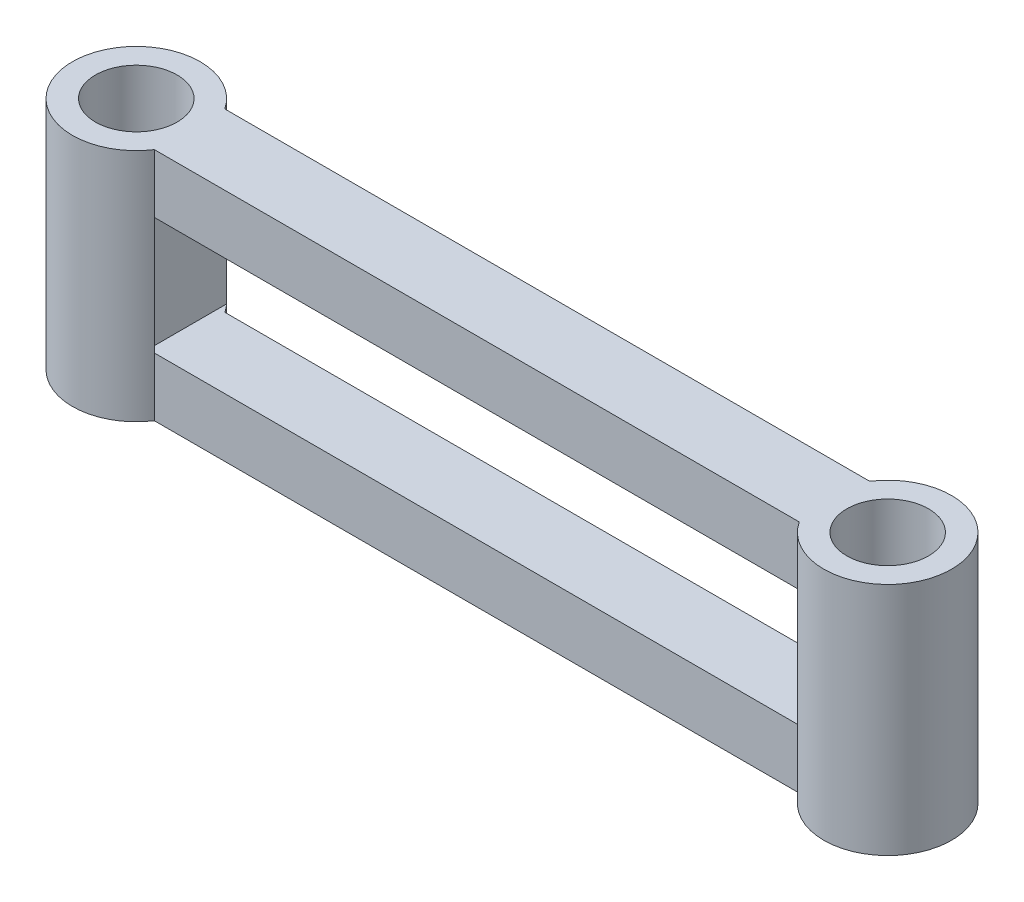
ISO-10303-21;
HEADER;
FILE_DESCRIPTION(('STEP AP214'),'2;1');
FILE_NAME('part.step','',(''),(''),'','','');
FILE_SCHEMA(('AUTOMOTIVE_DESIGN { 1 0 10303 214 1 1 1 1 }'));
ENDSEC;
DATA;
#1=APPLICATION_CONTEXT('core data for automotive mechanical design processes');
#2=APPLICATION_PROTOCOL_DEFINITION('international standard','automotive_design',2000,#1);
#3=PRODUCT_CONTEXT('',#1,'mechanical');
#4=PRODUCT('Part','Part','',(#3));
#5=PRODUCT_RELATED_PRODUCT_CATEGORY('part','',(#4));
#6=PRODUCT_DEFINITION_FORMATION('','',#4);
#7=PRODUCT_DEFINITION_CONTEXT('part definition',#1,'design');
#8=PRODUCT_DEFINITION('design','',#6,#7);
#9=PRODUCT_DEFINITION_SHAPE('','',#8);
#10=(LENGTH_UNIT() NAMED_UNIT(*) SI_UNIT(.MILLI.,.METRE.));
#11=(NAMED_UNIT(*) PLANE_ANGLE_UNIT() SI_UNIT($,.RADIAN.));
#12=(NAMED_UNIT(*) SI_UNIT($,.STERADIAN.) SOLID_ANGLE_UNIT());
#13=UNCERTAINTY_MEASURE_WITH_UNIT(LENGTH_MEASURE(1.E-05),#10,'distance_accuracy_value','');
#14=(GEOMETRIC_REPRESENTATION_CONTEXT(3) GLOBAL_UNCERTAINTY_ASSIGNED_CONTEXT((#13)) GLOBAL_UNIT_ASSIGNED_CONTEXT((#10,
#11,#12)) REPRESENTATION_CONTEXT('',''));
#15=CARTESIAN_POINT('',(0.,0.,0.));
#16=DIRECTION('',(0.,0.,1.));
#17=DIRECTION('',(1.,0.,0.));
#18=AXIS2_PLACEMENT_3D('',#15,#16,#17);
#19=CARTESIAN_POINT('',(-87.1917954276045,63.5,-39.9792105698021));
#20=DIRECTION('',(0.,0.,-1.));
#21=DIRECTION('',(-1.,0.,0.));
#22=AXIS2_PLACEMENT_3D('',#19,#20,#21);
#23=PLANE('',#22);
#24=DIRECTION('',(0.,-1.,0.));
#25=VECTOR('',#24,1.);
#26=CARTESIAN_POINT('',(-87.1917954276045,63.5,-39.9792105698021));
#27=LINE('',#26,#25);
#28=CARTESIAN_POINT('',(-87.1917954276045,63.5,-39.9792105698021));
#29=VERTEX_POINT('',#28);
#30=CARTESIAN_POINT('',(-87.1917954276045,47.625,-39.9792105698022));
#31=VERTEX_POINT('',#30);
#32=EDGE_CURVE('E250',#29,#31,#27,.T.);
#33=ORIENTED_EDGE('',*,*,#32,.T.);
#34=DIRECTION('',(-1.,0.,0.));
#35=VECTOR('',#34,1.);
#36=CARTESIAN_POINT('',(-88.9,47.625,-39.9792105698022));
#37=LINE('',#36,#35);
#38=CARTESIAN_POINT('',(87.1917954276044,47.625,-39.9792105698022));
#39=VERTEX_POINT('',#38);
#40=EDGE_CURVE('E166',#39,#31,#37,.T.);
#41=ORIENTED_EDGE('',*,*,#40,.F.);
#42=DIRECTION('',(0.,-1.,0.));
#43=VECTOR('',#42,1.);
#44=CARTESIAN_POINT('',(87.1917954276044,63.5,-39.9792105698022));
#45=LINE('',#44,#43);
#46=CARTESIAN_POINT('',(87.1917954276044,63.5,-39.9792105698022));
#47=VERTEX_POINT('',#46);
#48=EDGE_CURVE('E244',#47,#39,#45,.T.);
#49=ORIENTED_EDGE('',*,*,#48,.F.);
#50=DIRECTION('',(1.,0.,0.));
#51=VECTOR('',#50,1.);
#52=CARTESIAN_POINT('',(-87.1917954276045,63.5,-39.9792105698021));
#53=LINE('',#52,#51);
#54=EDGE_CURVE('E209',#29,#47,#53,.T.);
#55=ORIENTED_EDGE('',*,*,#54,.F.);
#56=EDGE_LOOP('',(#33,#41,#49,#55));
#57=FACE_BOUND('',#56,.T.);
#58=ADVANCED_FACE('F39',(#57),#23,.F.);
#59=CARTESIAN_POINT('',(-87.1917954276045,63.5,-59.0292105698022));
#60=DIRECTION('',(0.,0.,1.));
#61=DIRECTION('',(1.,0.,0.));
#62=AXIS2_PLACEMENT_3D('',#59,#60,#61);
#63=PLANE('',#62);
#64=DIRECTION('',(0.,-1.,0.));
#65=VECTOR('',#64,1.);
#66=CARTESIAN_POINT('',(87.1917954276044,63.5,-59.0292105698022));
#67=LINE('',#66,#65);
#68=CARTESIAN_POINT('',(87.1917954276044,63.5,-59.0292105698022));
#69=VERTEX_POINT('',#68);
#70=CARTESIAN_POINT('',(87.1917954276045,47.625,-59.0292105698022));
#71=VERTEX_POINT('',#70);
#72=EDGE_CURVE('E239',#69,#71,#67,.T.);
#73=ORIENTED_EDGE('',*,*,#72,.T.);
#74=DIRECTION('',(-1.,0.,0.));
#75=VECTOR('',#74,1.);
#76=CARTESIAN_POINT('',(-87.1917954276045,47.625,-59.0292105698022));
#77=LINE('',#76,#75);
#78=CARTESIAN_POINT('',(-87.1917954276045,47.625,-59.0292105698022));
#79=VERTEX_POINT('',#78);
#80=EDGE_CURVE('E257',#71,#79,#77,.T.);
#81=ORIENTED_EDGE('',*,*,#80,.T.);
#82=DIRECTION('',(0.,-1.,0.));
#83=VECTOR('',#82,1.);
#84=CARTESIAN_POINT('',(-87.1917954276045,63.5,-59.0292105698022));
#85=LINE('',#84,#83);
#86=CARTESIAN_POINT('',(-87.1917954276045,63.5,-59.0292105698022));
#87=VERTEX_POINT('',#86);
#88=EDGE_CURVE('E234',#87,#79,#85,.T.);
#89=ORIENTED_EDGE('',*,*,#88,.F.);
#90=DIRECTION('',(-1.,0.,0.));
#91=VECTOR('',#90,1.);
#92=CARTESIAN_POINT('',(-87.1917954276045,63.5,-59.0292105698022));
#93=LINE('',#92,#91);
#94=EDGE_CURVE('E216',#69,#87,#93,.T.);
#95=ORIENTED_EDGE('',*,*,#94,.F.);
#96=EDGE_LOOP('',(#73,#81,#89,#95));
#97=FACE_BOUND('',#96,.T.);
#98=ADVANCED_FACE('F303',(#97),#63,.F.);
#99=CARTESIAN_POINT('',(-101.6,63.5,-49.5042105698021));
#100=DIRECTION('',(0.,1.,0.));
#101=DIRECTION('',(0.,0.,1.));
#102=AXIS2_PLACEMENT_3D('',#99,#100,#101);
#103=PLANE('',#102);
#104=CARTESIAN_POINT('',(-101.6,63.5,-49.5042105698021));
#105=DIRECTION('',(0.,1.,0.));
#106=DIRECTION('',(0.,0.,1.));
#107=AXIS2_PLACEMENT_3D('',#104,#105,#106);
#108=CIRCLE('',#107,11.049);
#109=CARTESIAN_POINT('',(-101.6,63.5,-38.4552105698022));
#110=VERTEX_POINT('',#109);
#111=EDGE_CURVE('E197',#110,#110,#108,.T.);
#112=ORIENTED_EDGE('',*,*,#111,.F.);
#113=EDGE_LOOP('',(#112));
#114=FACE_BOUND('',#113,.T.);
#115=CARTESIAN_POINT('',(-101.6,63.5,-49.5042105698021));
#116=DIRECTION('',(0.,1.,0.));
#117=DIRECTION('',(0.,0.,1.));
#118=AXIS2_PLACEMENT_3D('',#115,#116,#117);
#119=CIRCLE('',#118,17.272);
#120=EDGE_CURVE('E205',#87,#29,#119,.T.);
#121=ORIENTED_EDGE('',*,*,#120,.T.);
#122=ORIENTED_EDGE('',*,*,#54,.T.);
#123=CARTESIAN_POINT('',(101.6,63.5,-49.5042105698021));
#124=DIRECTION('',(0.,1.,0.));
#125=DIRECTION('',(0.,0.,1.));
#126=AXIS2_PLACEMENT_3D('',#123,#124,#125);
#127=CIRCLE('',#126,17.272);
#128=EDGE_CURVE('E213',#47,#69,#127,.T.);
#129=ORIENTED_EDGE('',*,*,#128,.T.);
#130=ORIENTED_EDGE('',*,*,#94,.T.);
#131=EDGE_LOOP('',(#121,#122,#129,#130));
#132=FACE_BOUND('',#131,.T.);
#133=CARTESIAN_POINT('',(101.6,63.5,-49.5042105698021));
#134=DIRECTION('',(0.,1.,0.));
#135=DIRECTION('',(0.,0.,1.));
#136=AXIS2_PLACEMENT_3D('',#133,#134,#135);
#137=CIRCLE('',#136,11.049);
#138=CARTESIAN_POINT('',(101.6,63.5,-38.4552105698022));
#139=VERTEX_POINT('',#138);
#140=EDGE_CURVE('E189',#139,#139,#137,.T.);
#141=ORIENTED_EDGE('',*,*,#140,.F.);
#142=EDGE_LOOP('',(#141));
#143=FACE_BOUND('',#142,.T.);
#144=ADVANCED_FACE('F286',(#114,#132,#143),#103,.T.);
#145=CARTESIAN_POINT('',(-101.6,0.,-49.5042105698021));
#146=DIRECTION('',(0.,1.,0.));
#147=DIRECTION('',(0.,0.,1.));
#148=AXIS2_PLACEMENT_3D('',#145,#146,#147);
#149=PLANE('',#148);
#150=CARTESIAN_POINT('',(-101.6,0.,-49.5042105698021));
#151=DIRECTION('',(0.,1.,0.));
#152=DIRECTION('',(0.,0.,1.));
#153=AXIS2_PLACEMENT_3D('',#150,#151,#152);
#154=CIRCLE('',#153,17.272);
#155=CARTESIAN_POINT('',(-87.1917954276045,0.,-59.0292105698022));
#156=VERTEX_POINT('',#155);
#157=CARTESIAN_POINT('',(-87.1917954276045,0.,-39.9792105698021));
#158=VERTEX_POINT('',#157);
#159=EDGE_CURVE('E201',#156,#158,#154,.T.);
#160=ORIENTED_EDGE('',*,*,#159,.F.);
#161=DIRECTION('',(-1.,0.,0.));
#162=VECTOR('',#161,1.);
#163=CARTESIAN_POINT('',(-87.1917954276045,0.,-59.0292105698022));
#164=LINE('',#163,#162);
#165=CARTESIAN_POINT('',(87.1917954276044,0.,-59.0292105698022));
#166=VERTEX_POINT('',#165);
#167=EDGE_CURVE('E210',#166,#156,#164,.T.);
#168=ORIENTED_EDGE('',*,*,#167,.F.);
#169=CARTESIAN_POINT('',(101.6,0.,-49.5042105698021));
#170=DIRECTION('',(0.,1.,0.));
#171=DIRECTION('',(0.,0.,1.));
#172=AXIS2_PLACEMENT_3D('',#169,#170,#171);
#173=CIRCLE('',#172,17.272);
#174=CARTESIAN_POINT('',(87.1917954276044,0.,-39.9792105698022));
#175=VERTEX_POINT('',#174);
#176=EDGE_CURVE('E227',#175,#166,#173,.T.);
#177=ORIENTED_EDGE('',*,*,#176,.F.);
#178=DIRECTION('',(1.,0.,0.));
#179=VECTOR('',#178,1.);
#180=CARTESIAN_POINT('',(-87.1917954276045,0.,-39.9792105698021));
#181=LINE('',#180,#179);
#182=EDGE_CURVE('E223',#158,#175,#181,.T.);
#183=ORIENTED_EDGE('',*,*,#182,.F.);
#184=EDGE_LOOP('',(#160,#168,#177,#183));
#185=FACE_BOUND('',#184,.T.);
#186=CARTESIAN_POINT('',(-101.6,0.,-49.5042105698021));
#187=DIRECTION('',(0.,1.,0.));
#188=DIRECTION('',(0.,0.,1.));
#189=AXIS2_PLACEMENT_3D('',#186,#187,#188);
#190=CIRCLE('',#189,11.049);
#191=CARTESIAN_POINT('',(-101.6,0.,-38.4552105698022));
#192=VERTEX_POINT('',#191);
#193=EDGE_CURVE('E193',#192,#192,#190,.T.);
#194=ORIENTED_EDGE('',*,*,#193,.T.);
#195=EDGE_LOOP('',(#194));
#196=FACE_BOUND('',#195,.T.);
#197=CARTESIAN_POINT('',(101.6,0.,-49.5042105698021));
#198=DIRECTION('',(0.,1.,0.));
#199=DIRECTION('',(0.,0.,1.));
#200=AXIS2_PLACEMENT_3D('',#197,#198,#199);
#201=CIRCLE('',#200,11.049);
#202=CARTESIAN_POINT('',(101.6,0.,-38.4552105698022));
#203=VERTEX_POINT('',#202);
#204=EDGE_CURVE('E188',#203,#203,#201,.T.);
#205=ORIENTED_EDGE('',*,*,#204,.T.);
#206=EDGE_LOOP('',(#205));
#207=FACE_BOUND('',#206,.T.);
#208=ADVANCED_FACE('F311',(#185,#196,#207),#149,.F.);
#209=CARTESIAN_POINT('',(-101.6,63.5,-49.5042105698021));
#210=DIRECTION('',(0.,-1.,0.));
#211=DIRECTION('',(0.,0.,-1.));
#212=AXIS2_PLACEMENT_3D('',#209,#210,#211);
#213=CYLINDRICAL_SURFACE('',#212,17.272);
#214=ORIENTED_EDGE('',*,*,#88,.T.);
#215=CARTESIAN_POINT('',(-101.6,47.625,-49.5042105698021));
#216=DIRECTION('',(0.,1.,0.));
#217=DIRECTION('',(0.,0.,1.));
#218=AXIS2_PLACEMENT_3D('',#215,#216,#217);
#219=CIRCLE('',#218,17.272);
#220=CARTESIAN_POINT('',(-88.9,47.625,-61.2102766895539));
#221=VERTEX_POINT('',#220);
#222=EDGE_CURVE('E182',#79,#221,#219,.T.);
#223=ORIENTED_EDGE('',*,*,#222,.T.);
#224=DIRECTION('',(0.,-1.,0.));
#225=VECTOR('',#224,1.);
#226=CARTESIAN_POINT('',(-88.9,63.5,-61.2102766895539));
#227=LINE('',#226,#225);
#228=CARTESIAN_POINT('',(-88.9,15.875,-61.2102766895539));
#229=VERTEX_POINT('',#228);
#230=EDGE_CURVE('E11',#221,#229,#227,.T.);
#231=ORIENTED_EDGE('',*,*,#230,.T.);
#232=CARTESIAN_POINT('',(-101.6,15.875,-49.5042105698021));
#233=DIRECTION('',(0.,-1.,0.));
#234=DIRECTION('',(0.,0.,-1.));
#235=AXIS2_PLACEMENT_3D('',#232,#233,#234);
#236=CIRCLE('',#235,17.272);
#237=CARTESIAN_POINT('',(-87.1917954276045,15.875,-59.0292105698022));
#238=VERTEX_POINT('',#237);
#239=EDGE_CURVE('E134',#229,#238,#236,.T.);
#240=ORIENTED_EDGE('',*,*,#239,.T.);
#241=EDGE_CURVE('E219',#238,#156,#85,.T.);
#242=ORIENTED_EDGE('',*,*,#241,.T.);
#243=ORIENTED_EDGE('',*,*,#159,.T.);
#244=CARTESIAN_POINT('',(-87.1917954276045,15.875,-39.9792105698022));
#245=VERTEX_POINT('',#244);
#246=EDGE_CURVE('E248',#245,#158,#27,.T.);
#247=ORIENTED_EDGE('',*,*,#246,.F.);
#248=DIRECTION('',(0.,-1.,0.));
#249=VECTOR('',#248,1.);
#250=CARTESIAN_POINT('',(-87.1917954276045,63.5,-39.9792105698022));
#251=LINE('',#250,#249);
#252=EDGE_CURVE('E146',#245,#31,#251,.F.);
#253=ORIENTED_EDGE('',*,*,#252,.T.);
#254=ORIENTED_EDGE('',*,*,#32,.F.);
#255=ORIENTED_EDGE('',*,*,#120,.F.);
#256=EDGE_LOOP('',(#214,#223,#231,#240,#242,#243,#247,#253,#254,#255));
#257=FACE_BOUND('',#256,.T.);
#258=ADVANCED_FACE('F41',(#257),#213,.T.);
#259=CARTESIAN_POINT('',(87.1917954276044,15.875,-39.9792105698022));
#260=VERTEX_POINT('',#259);
#261=EDGE_CURVE('E243',#260,#175,#45,.T.);
#262=ORIENTED_EDGE('',*,*,#261,.F.);
#263=DIRECTION('',(1.,0.,0.));
#264=VECTOR('',#263,1.);
#265=CARTESIAN_POINT('',(-88.9,15.875,-39.9792105698022));
#266=LINE('',#265,#264);
#267=EDGE_CURVE('E55',#245,#260,#266,.T.);
#268=ORIENTED_EDGE('',*,*,#267,.F.);
#269=ORIENTED_EDGE('',*,*,#246,.T.);
#270=ORIENTED_EDGE('',*,*,#182,.T.);
#271=EDGE_LOOP('',(#262,#268,#269,#270));
#272=FACE_BOUND('',#271,.T.);
#273=ADVANCED_FACE('F314',(#272),#23,.F.);
#274=CARTESIAN_POINT('',(101.6,63.5,-49.5042105698021));
#275=DIRECTION('',(0.,-1.,0.));
#276=DIRECTION('',(0.,0.,-1.));
#277=AXIS2_PLACEMENT_3D('',#274,#275,#276);
#278=CYLINDRICAL_SURFACE('',#277,17.272);
#279=DIRECTION('',(0.,-1.,0.));
#280=VECTOR('',#279,1.);
#281=CARTESIAN_POINT('',(88.9,63.5,-61.2102766895539));
#282=LINE('',#281,#280);
#283=CARTESIAN_POINT('',(88.9,15.875,-61.2102766895539));
#284=VERTEX_POINT('',#283);
#285=CARTESIAN_POINT('',(88.9,47.625,-61.2102766895539));
#286=VERTEX_POINT('',#285);
#287=EDGE_CURVE('E48',#284,#286,#282,.F.);
#288=ORIENTED_EDGE('',*,*,#287,.T.);
#289=CARTESIAN_POINT('',(101.6,47.625,-49.5042105698021));
#290=DIRECTION('',(0.,1.,0.));
#291=DIRECTION('',(0.,0.,1.));
#292=AXIS2_PLACEMENT_3D('',#289,#290,#291);
#293=CIRCLE('',#292,17.272);
#294=EDGE_CURVE('E178',#286,#71,#293,.T.);
#295=ORIENTED_EDGE('',*,*,#294,.T.);
#296=ORIENTED_EDGE('',*,*,#72,.F.);
#297=ORIENTED_EDGE('',*,*,#128,.F.);
#298=ORIENTED_EDGE('',*,*,#48,.T.);
#299=EDGE_CURVE('E249',#39,#260,#45,.T.);
#300=ORIENTED_EDGE('',*,*,#299,.T.);
#301=ORIENTED_EDGE('',*,*,#261,.T.);
#302=ORIENTED_EDGE('',*,*,#176,.T.);
#303=CARTESIAN_POINT('',(87.1917954276044,15.875,-59.0292105698022));
#304=VERTEX_POINT('',#303);
#305=EDGE_CURVE('E238',#304,#166,#67,.T.);
#306=ORIENTED_EDGE('',*,*,#305,.F.);
#307=CARTESIAN_POINT('',(101.6,15.875,-49.5042105698021));
#308=DIRECTION('',(0.,-1.,0.));
#309=DIRECTION('',(0.,0.,-1.));
#310=AXIS2_PLACEMENT_3D('',#307,#308,#309);
#311=CIRCLE('',#310,17.272);
#312=EDGE_CURVE('E62',#304,#284,#311,.T.);
#313=ORIENTED_EDGE('',*,*,#312,.T.);
#314=EDGE_LOOP('',(#288,#295,#296,#297,#298,#300,#301,#302,#306,#313));
#315=FACE_BOUND('',#314,.T.);
#316=ADVANCED_FACE('F263',(#315),#278,.T.);
#317=ORIENTED_EDGE('',*,*,#241,.F.);
#318=DIRECTION('',(1.,0.,0.));
#319=VECTOR('',#318,1.);
#320=CARTESIAN_POINT('',(-87.1917954276045,15.875,-59.0292105698022));
#321=LINE('',#320,#319);
#322=EDGE_CURVE('E254',#238,#304,#321,.T.);
#323=ORIENTED_EDGE('',*,*,#322,.T.);
#324=ORIENTED_EDGE('',*,*,#305,.T.);
#325=ORIENTED_EDGE('',*,*,#167,.T.);
#326=EDGE_LOOP('',(#317,#323,#324,#325));
#327=FACE_BOUND('',#326,.T.);
#328=ADVANCED_FACE('F306',(#327),#63,.F.);
#329=CARTESIAN_POINT('',(-101.6,63.5,-49.5042105698021));
#330=DIRECTION('',(0.,-1.,0.));
#331=DIRECTION('',(0.,0.,-1.));
#332=AXIS2_PLACEMENT_3D('',#329,#330,#331);
#333=CYLINDRICAL_SURFACE('',#332,11.049);
#334=ORIENTED_EDGE('',*,*,#111,.T.);
#335=EDGE_LOOP('',(#334));
#336=FACE_BOUND('',#335,.T.);
#337=ORIENTED_EDGE('',*,*,#193,.F.);
#338=EDGE_LOOP('',(#337));
#339=FACE_BOUND('',#338,.T.);
#340=ADVANCED_FACE('F318',(#336,#339),#333,.F.);
#341=CARTESIAN_POINT('',(101.6,63.5,-49.5042105698021));
#342=DIRECTION('',(0.,-1.,0.));
#343=DIRECTION('',(0.,0.,-1.));
#344=AXIS2_PLACEMENT_3D('',#341,#342,#343);
#345=CYLINDRICAL_SURFACE('',#344,11.049);
#346=ORIENTED_EDGE('',*,*,#140,.T.);
#347=EDGE_LOOP('',(#346));
#348=FACE_BOUND('',#347,.T.);
#349=ORIENTED_EDGE('',*,*,#204,.F.);
#350=EDGE_LOOP('',(#349));
#351=FACE_BOUND('',#350,.T.);
#352=ADVANCED_FACE('F324',(#348,#351),#345,.F.);
#353=CARTESIAN_POINT('',(-88.9,47.625,-66.7762105698021));
#354=DIRECTION('',(-1.,0.,0.));
#355=DIRECTION('',(0.,0.,1.));
#356=AXIS2_PLACEMENT_3D('',#353,#354,#355);
#357=PLANE('',#356);
#358=DIRECTION('',(0.,0.,1.));
#359=VECTOR('',#358,1.);
#360=CARTESIAN_POINT('',(-88.9,47.625,-66.7762105698021));
#361=LINE('',#360,#359);
#362=CARTESIAN_POINT('',(-88.9,47.625,-39.9792105698022));
#363=VERTEX_POINT('',#362);
#364=EDGE_CURVE('E153',#221,#363,#361,.T.);
#365=ORIENTED_EDGE('',*,*,#364,.T.);
#366=DIRECTION('',(0.,-1.,0.));
#367=VECTOR('',#366,1.);
#368=CARTESIAN_POINT('',(-88.9,47.625,-39.9792105698022));
#369=LINE('',#368,#367);
#370=CARTESIAN_POINT('',(-88.9,15.875,-39.9792105698022));
#371=VERTEX_POINT('',#370);
#372=EDGE_CURVE('E144',#363,#371,#369,.T.);
#373=ORIENTED_EDGE('',*,*,#372,.T.);
#374=DIRECTION('',(0.,0.,1.));
#375=VECTOR('',#374,1.);
#376=CARTESIAN_POINT('',(-88.9,15.875,-66.7762105698021));
#377=LINE('',#376,#375);
#378=EDGE_CURVE('E129',#229,#371,#377,.T.);
#379=ORIENTED_EDGE('',*,*,#378,.F.);
#380=ORIENTED_EDGE('',*,*,#230,.F.);
#381=EDGE_LOOP('',(#365,#373,#379,#380));
#382=FACE_BOUND('',#381,.T.);
#383=ADVANCED_FACE('F151',(#382),#357,.F.);
#384=CARTESIAN_POINT('',(88.9,47.625,-66.7762105698021));
#385=DIRECTION('',(1.,0.,0.));
#386=DIRECTION('',(0.,1.,0.));
#387=AXIS2_PLACEMENT_3D('',#384,#385,#386);
#388=PLANE('',#387);
#389=DIRECTION('',(0.,0.,1.));
#390=VECTOR('',#389,1.);
#391=CARTESIAN_POINT('',(88.9,15.875,-66.7762105698021));
#392=LINE('',#391,#390);
#393=CARTESIAN_POINT('',(88.9,15.875,-39.9792105698022));
#394=VERTEX_POINT('',#393);
#395=EDGE_CURVE('E138',#284,#394,#392,.T.);
#396=ORIENTED_EDGE('',*,*,#395,.T.);
#397=DIRECTION('',(0.,1.,0.));
#398=VECTOR('',#397,1.);
#399=CARTESIAN_POINT('',(88.9,47.625,-39.9792105698022));
#400=LINE('',#399,#398);
#401=CARTESIAN_POINT('',(88.9,47.625,-39.9792105698022));
#402=VERTEX_POINT('',#401);
#403=EDGE_CURVE('E148',#394,#402,#400,.T.);
#404=ORIENTED_EDGE('',*,*,#403,.T.);
#405=DIRECTION('',(0.,0.,1.));
#406=VECTOR('',#405,1.);
#407=CARTESIAN_POINT('',(88.9,47.625,-66.7762105698021));
#408=LINE('',#407,#406);
#409=EDGE_CURVE('E169',#286,#402,#408,.T.);
#410=ORIENTED_EDGE('',*,*,#409,.F.);
#411=ORIENTED_EDGE('',*,*,#287,.F.);
#412=EDGE_LOOP('',(#396,#404,#410,#411));
#413=FACE_BOUND('',#412,.T.);
#414=ADVANCED_FACE('F268',(#413),#388,.F.);
#415=CARTESIAN_POINT('',(0.,0.,-39.9792105698022));
#416=DIRECTION('',(0.,0.,1.));
#417=DIRECTION('',(1.,0.,0.));
#418=AXIS2_PLACEMENT_3D('',#415,#416,#417);
#419=PLANE('',#418);
#420=EDGE_CURVE('E132',#371,#245,#266,.T.);
#421=ORIENTED_EDGE('',*,*,#420,.F.);
#422=ORIENTED_EDGE('',*,*,#372,.F.);
#423=EDGE_CURVE('E162',#31,#363,#37,.T.);
#424=ORIENTED_EDGE('',*,*,#423,.F.);
#425=ORIENTED_EDGE('',*,*,#252,.F.);
#426=EDGE_LOOP('',(#421,#422,#424,#425));
#427=FACE_BOUND('',#426,.T.);
#428=ADVANCED_FACE('F143',(#427),#419,.F.);
#429=EDGE_CURVE('E139',#402,#39,#37,.T.);
#430=ORIENTED_EDGE('',*,*,#429,.F.);
#431=ORIENTED_EDGE('',*,*,#403,.F.);
#432=EDGE_CURVE('E150',#260,#394,#266,.T.);
#433=ORIENTED_EDGE('',*,*,#432,.F.);
#434=ORIENTED_EDGE('',*,*,#299,.F.);
#435=EDGE_LOOP('',(#430,#431,#433,#434));
#436=FACE_BOUND('',#435,.T.);
#437=ADVANCED_FACE('F273',(#436),#419,.F.);
#438=CARTESIAN_POINT('',(-88.9,47.625,-66.7762105698021));
#439=DIRECTION('',(0.,1.,0.));
#440=DIRECTION('',(0.,0.,1.));
#441=AXIS2_PLACEMENT_3D('',#438,#439,#440);
#442=PLANE('',#441);
#443=ORIENTED_EDGE('',*,*,#80,.F.);
#444=ORIENTED_EDGE('',*,*,#294,.F.);
#445=ORIENTED_EDGE('',*,*,#409,.T.);
#446=ORIENTED_EDGE('',*,*,#429,.T.);
#447=ORIENTED_EDGE('',*,*,#40,.T.);
#448=ORIENTED_EDGE('',*,*,#423,.T.);
#449=ORIENTED_EDGE('',*,*,#364,.F.);
#450=ORIENTED_EDGE('',*,*,#222,.F.);
#451=EDGE_LOOP('',(#443,#444,#445,#446,#447,#448,#449,#450));
#452=FACE_BOUND('',#451,.T.);
#453=ADVANCED_FACE('F278',(#452),#442,.F.);
#454=CARTESIAN_POINT('',(-88.9,15.875,-66.7762105698021));
#455=DIRECTION('',(0.,-1.,0.));
#456=DIRECTION('',(0.,0.,-1.));
#457=AXIS2_PLACEMENT_3D('',#454,#455,#456);
#458=PLANE('',#457);
#459=ORIENTED_EDGE('',*,*,#378,.T.);
#460=ORIENTED_EDGE('',*,*,#420,.T.);
#461=ORIENTED_EDGE('',*,*,#267,.T.);
#462=ORIENTED_EDGE('',*,*,#432,.T.);
#463=ORIENTED_EDGE('',*,*,#395,.F.);
#464=ORIENTED_EDGE('',*,*,#312,.F.);
#465=ORIENTED_EDGE('',*,*,#322,.F.);
#466=ORIENTED_EDGE('',*,*,#239,.F.);
#467=EDGE_LOOP('',(#459,#460,#461,#462,#463,#464,#465,#466));
#468=FACE_BOUND('',#467,.T.);
#469=ADVANCED_FACE('F131',(#468),#458,.F.);
#470=CLOSED_SHELL('',(#58,#98,#144,#208,#258,#273,#316,#328,#340,#352,#383,#414,#428,#437,#453,#469));
#471=MANIFOLD_SOLID_BREP('B2',#470);
#472=ADVANCED_BREP_SHAPE_REPRESENTATION('',(#18,#471),#14);
#473=SHAPE_DEFINITION_REPRESENTATION(#9,#472);
ENDSEC;
END-ISO-10303-21;
